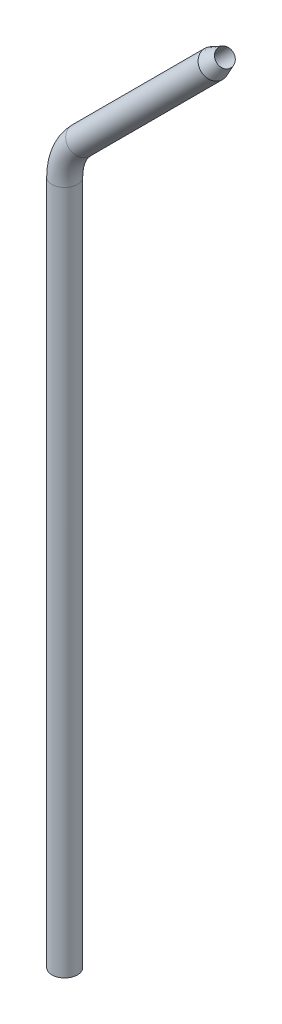
ISO-10303-21;
HEADER;
FILE_DESCRIPTION(('STEP AP214'),'2;1');
FILE_NAME('part.step','',(''),(''),'','','');
FILE_SCHEMA(('AUTOMOTIVE_DESIGN { 1 0 10303 214 1 1 1 1 }'));
ENDSEC;
DATA;
#1=APPLICATION_CONTEXT('core data for automotive mechanical design processes');
#2=APPLICATION_PROTOCOL_DEFINITION('international standard','automotive_design',2000,#1);
#3=PRODUCT_CONTEXT('',#1,'mechanical');
#4=PRODUCT('Part','Part','',(#3));
#5=PRODUCT_RELATED_PRODUCT_CATEGORY('part','',(#4));
#6=PRODUCT_DEFINITION_FORMATION('','',#4);
#7=PRODUCT_DEFINITION_CONTEXT('part definition',#1,'design');
#8=PRODUCT_DEFINITION('design','',#6,#7);
#9=PRODUCT_DEFINITION_SHAPE('','',#8);
#10=(LENGTH_UNIT() NAMED_UNIT(*) SI_UNIT(.MILLI.,.METRE.));
#11=(NAMED_UNIT(*) PLANE_ANGLE_UNIT() SI_UNIT($,.RADIAN.));
#12=(NAMED_UNIT(*) SI_UNIT($,.STERADIAN.) SOLID_ANGLE_UNIT());
#13=UNCERTAINTY_MEASURE_WITH_UNIT(LENGTH_MEASURE(1.E-05),#10,'distance_accuracy_value','');
#14=(GEOMETRIC_REPRESENTATION_CONTEXT(3) GLOBAL_UNCERTAINTY_ASSIGNED_CONTEXT((#13)) GLOBAL_UNIT_ASSIGNED_CONTEXT((#10,
#11,#12)) REPRESENTATION_CONTEXT('',''));
#15=CARTESIAN_POINT('',(0.,0.,0.));
#16=DIRECTION('',(0.,0.,1.));
#17=DIRECTION('',(1.,0.,0.));
#18=AXIS2_PLACEMENT_3D('',#15,#16,#17);
#19=CARTESIAN_POINT('',(0.585786437626908,25.5857864376269,0.));
#20=DIRECTION('',(0.707106781186549,0.707106781186546,0.));
#21=DIRECTION('',(-0.707106781186546,0.707106781186549,0.));
#22=AXIS2_PLACEMENT_3D('',#19,#20,#21);
#23=CYLINDRICAL_SURFACE('',#22,0.45);
#24=CARTESIAN_POINT('',(0.585786437626908,25.5857864376269,0.));
#25=DIRECTION('',(0.707106781186549,0.707106781186546,0.));
#26=DIRECTION('',(0.,0.,1.));
#27=AXIS2_PLACEMENT_3D('',#24,#25,#26);
#28=CIRCLE('',#27,0.45);
#29=CARTESIAN_POINT('',(0.267588386092961,25.9039844891609,0.));
#30=VERTEX_POINT('',#29);
#31=EDGE_CURVE('E12',#30,#30,#28,.T.);
#32=ORIENTED_EDGE('',*,*,#31,.T.);
#33=EDGE_LOOP('',(#32));
#34=FACE_BOUND('',#33,.T.);
#35=CARTESIAN_POINT('',(5.26101048442771,30.2610104844277,0.));
#36=DIRECTION('',(0.707106781186547,0.707106781186548,0.));
#37=DIRECTION('',(-0.707106781186548,0.707106781186547,0.));
#38=AXIS2_PLACEMENT_3D('',#35,#36,#37);
#39=CIRCLE('',#38,0.449999999999991);
#40=CARTESIAN_POINT('',(4.94281243289377,30.5792085359616,0.));
#41=VERTEX_POINT('',#40);
#42=EDGE_CURVE('E72',#41,#41,#39,.T.);
#43=ORIENTED_EDGE('',*,*,#42,.F.);
#44=EDGE_LOOP('',(#43));
#45=FACE_BOUND('',#44,.T.);
#46=ADVANCED_FACE('F44',(#34,#45),#23,.T.);
#47=CARTESIAN_POINT('',(0.585786437626908,25.5857864376269,0.));
#48=DIRECTION('',(0.707106781186549,0.707106781186546,0.));
#49=DIRECTION('',(-0.707106781186546,0.707106781186549,0.));
#50=AXIS2_PLACEMENT_3D('',#47,#48,#49);
#51=CYLINDRICAL_SURFACE('',#50,0.3);
#52=CARTESIAN_POINT('',(0.585786437626908,25.5857864376269,0.));
#53=DIRECTION('',(0.707106781186549,0.707106781186546,0.));
#54=DIRECTION('',(0.,0.,1.));
#55=AXIS2_PLACEMENT_3D('',#52,#53,#54);
#56=CIRCLE('',#55,0.3);
#57=CARTESIAN_POINT('',(0.373654403270944,25.7979184719829,0.));
#58=VERTEX_POINT('',#57);
#59=EDGE_CURVE('E50',#58,#58,#56,.T.);
#60=ORIENTED_EDGE('',*,*,#59,.F.);
#61=EDGE_LOOP('',(#60));
#62=FACE_BOUND('',#61,.T.);
#63=CARTESIAN_POINT('',(5.65685424949239,30.6568542494924,0.));
#64=DIRECTION('',(0.707106781186547,0.707106781186548,0.));
#65=DIRECTION('',(-0.707106781186548,0.707106781186547,0.));
#66=AXIS2_PLACEMENT_3D('',#63,#64,#65);
#67=CIRCLE('',#66,0.299999999999999);
#68=CARTESIAN_POINT('',(5.44472221513643,30.8689862838483,0.));
#69=VERTEX_POINT('',#68);
#70=EDGE_CURVE('E66',#69,#69,#67,.T.);
#71=ORIENTED_EDGE('',*,*,#70,.T.);
#72=EDGE_LOOP('',(#71));
#73=FACE_BOUND('',#72,.T.);
#74=ADVANCED_FACE('F80',(#62,#73),#51,.F.);
#75=CARTESIAN_POINT('',(2.,24.1715728752538,0.));
#76=DIRECTION('',(0.,0.,-1.));
#77=DIRECTION('',(-1.,0.,0.));
#78=AXIS2_PLACEMENT_3D('',#75,#76,#77);
#79=TOROIDAL_SURFACE('',#78,2.,0.45);
#80=CARTESIAN_POINT('',(0.,24.1715728752538,0.));
#81=DIRECTION('',(0.,1.,0.));
#82=DIRECTION('',(0.,0.,1.));
#83=AXIS2_PLACEMENT_3D('',#80,#81,#82);
#84=CIRCLE('',#83,0.45);
#85=CARTESIAN_POINT('',(-0.45,24.1715728752538,0.));
#86=VERTEX_POINT('',#85);
#87=EDGE_CURVE('E54',#86,#86,#84,.T.);
#88=CARTESIAN_POINT('',(2.,24.1715728752538,0.));
#89=DIRECTION('',(0.,0.,-1.));
#90=DIRECTION('',(-1.,0.,0.));
#91=AXIS2_PLACEMENT_3D('',#88,#89,#90);
#92=CIRCLE('',#91,2.45);
#93=EDGE_CURVE('',#86,#30,#92,.T.);
#94=ORIENTED_EDGE('',*,*,#87,.T.);
#95=ORIENTED_EDGE('',*,*,#31,.F.);
#96=ORIENTED_EDGE('',*,*,#93,.T.);
#97=ORIENTED_EDGE('',*,*,#93,.F.);
#98=EDGE_LOOP('',(#94,#96,#95,#97));
#99=FACE_BOUND('',#98,.T.);
#100=ADVANCED_FACE('F84',(#99),#79,.T.);
#101=CARTESIAN_POINT('',(2.,24.1715728752538,0.));
#102=DIRECTION('',(0.,0.,-1.));
#103=DIRECTION('',(-1.,0.,0.));
#104=AXIS2_PLACEMENT_3D('',#101,#102,#103);
#105=TOROIDAL_SURFACE('',#104,2.,0.3);
#106=CARTESIAN_POINT('',(0.,24.1715728752538,0.));
#107=DIRECTION('',(0.,1.,0.));
#108=DIRECTION('',(0.,0.,1.));
#109=AXIS2_PLACEMENT_3D('',#106,#107,#108);
#110=CIRCLE('',#109,0.3);
#111=CARTESIAN_POINT('',(-0.3,24.1715728752538,0.));
#112=VERTEX_POINT('',#111);
#113=EDGE_CURVE('E58',#112,#112,#110,.T.);
#114=CARTESIAN_POINT('',(2.,24.1715728752538,0.));
#115=DIRECTION('',(0.,0.,-1.));
#116=DIRECTION('',(-1.,0.,0.));
#117=AXIS2_PLACEMENT_3D('',#114,#115,#116);
#118=CIRCLE('',#117,2.3);
#119=EDGE_CURVE('',#112,#58,#118,.T.);
#120=ORIENTED_EDGE('',*,*,#113,.F.);
#121=ORIENTED_EDGE('',*,*,#59,.T.);
#122=ORIENTED_EDGE('',*,*,#119,.T.);
#123=ORIENTED_EDGE('',*,*,#119,.F.);
#124=EDGE_LOOP('',(#120,#122,#121,#123));
#125=FACE_BOUND('',#124,.T.);
#126=ADVANCED_FACE('F89',(#125),#105,.F.);
#127=CARTESIAN_POINT('',(0.,24.1715728752538,0.));
#128=DIRECTION('',(0.,-1.,0.));
#129=DIRECTION('',(0.,0.,-1.));
#130=AXIS2_PLACEMENT_3D('',#127,#128,#129);
#131=CYLINDRICAL_SURFACE('',#130,0.3);
#132=ORIENTED_EDGE('',*,*,#113,.T.);
#133=EDGE_LOOP('',(#132));
#134=FACE_BOUND('',#133,.T.);
#135=CARTESIAN_POINT('',(0.,0.,0.));
#136=DIRECTION('',(0.,1.,0.));
#137=DIRECTION('',(0.,0.,1.));
#138=AXIS2_PLACEMENT_3D('',#135,#136,#137);
#139=CIRCLE('',#138,0.3);
#140=CARTESIAN_POINT('',(0.,0.,0.3));
#141=VERTEX_POINT('',#140);
#142=EDGE_CURVE('E64',#141,#141,#139,.T.);
#143=ORIENTED_EDGE('',*,*,#142,.F.);
#144=EDGE_LOOP('',(#143));
#145=FACE_BOUND('',#144,.T.);
#146=ADVANCED_FACE('F96',(#134,#145),#131,.F.);
#147=CARTESIAN_POINT('',(0.,24.1715728752538,0.));
#148=DIRECTION('',(0.,-1.,0.));
#149=DIRECTION('',(0.,0.,-1.));
#150=AXIS2_PLACEMENT_3D('',#147,#148,#149);
#151=CYLINDRICAL_SURFACE('',#150,0.45);
#152=ORIENTED_EDGE('',*,*,#87,.F.);
#153=EDGE_LOOP('',(#152));
#154=FACE_BOUND('',#153,.T.);
#155=CARTESIAN_POINT('',(0.,0.,0.));
#156=DIRECTION('',(0.,1.,0.));
#157=DIRECTION('',(0.,0.,1.));
#158=AXIS2_PLACEMENT_3D('',#155,#156,#157);
#159=CIRCLE('',#158,0.45);
#160=CARTESIAN_POINT('',(0.,0.,0.45));
#161=VERTEX_POINT('',#160);
#162=EDGE_CURVE('E61',#161,#161,#159,.T.);
#163=ORIENTED_EDGE('',*,*,#162,.T.);
#164=EDGE_LOOP('',(#163));
#165=FACE_BOUND('',#164,.T.);
#166=ADVANCED_FACE('F100',(#154,#165),#151,.T.);
#167=CARTESIAN_POINT('',(0.,0.,0.));
#168=DIRECTION('',(0.,1.,0.));
#169=DIRECTION('',(0.,0.,1.));
#170=AXIS2_PLACEMENT_3D('',#167,#168,#169);
#171=PLANE('',#170);
#172=ORIENTED_EDGE('',*,*,#142,.T.);
#173=EDGE_LOOP('',(#172));
#174=FACE_BOUND('',#173,.T.);
#175=ORIENTED_EDGE('',*,*,#162,.F.);
#176=EDGE_LOOP('',(#175));
#177=FACE_BOUND('',#176,.T.);
#178=ADVANCED_FACE('F104',(#174,#177),#171,.F.);
#179=CARTESIAN_POINT('',(5.65685424949239,30.6568542494924,0.));
#180=DIRECTION('',(-0.707106781186547,-0.707106781186548,0.));
#181=DIRECTION('',(0.707106781186548,-0.707106781186547,0.));
#182=AXIS2_PLACEMENT_3D('',#179,#180,#181);
#183=CONICAL_SURFACE('',#182,0.299999999999999,0.26179938779915);
#184=ORIENTED_EDGE('',*,*,#42,.T.);
#185=EDGE_LOOP('',(#184));
#186=FACE_BOUND('',#185,.T.);
#187=ORIENTED_EDGE('',*,*,#70,.F.);
#188=EDGE_LOOP('',(#187));
#189=FACE_BOUND('',#188,.T.);
#190=ADVANCED_FACE('F76',(#186,#189),#183,.T.);
#191=CLOSED_SHELL('',(#46,#74,#100,#126,#146,#166,#178,#190));
#192=MANIFOLD_SOLID_BREP('B2',#191);
#193=ADVANCED_BREP_SHAPE_REPRESENTATION('',(#18,#192),#14);
#194=SHAPE_DEFINITION_REPRESENTATION(#9,#193);
ENDSEC;
END-ISO-10303-21;
